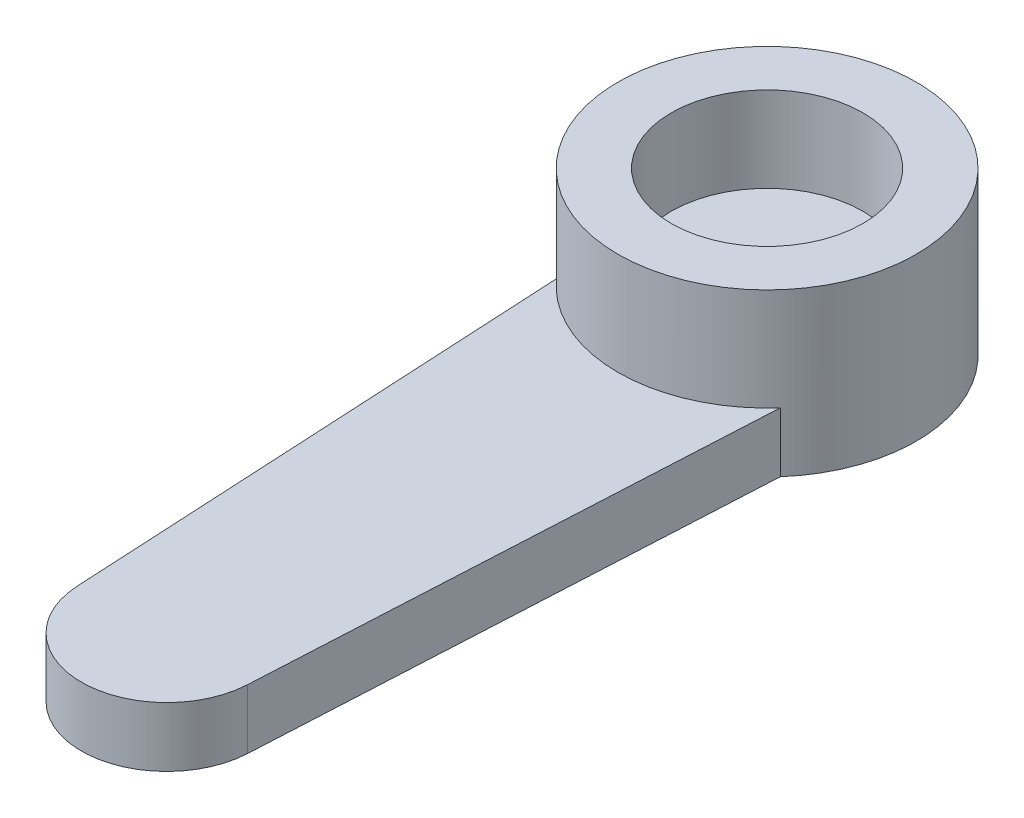
ISO-10303-21;
HEADER;
FILE_DESCRIPTION(('STEP AP214'),'2;1');
FILE_NAME('part.step','',(''),(''),'','','');
FILE_SCHEMA(('AUTOMOTIVE_DESIGN { 1 0 10303 214 1 1 1 1 }'));
ENDSEC;
DATA;
#1=APPLICATION_CONTEXT('core data for automotive mechanical design processes');
#2=APPLICATION_PROTOCOL_DEFINITION('international standard','automotive_design',2000,#1);
#3=PRODUCT_CONTEXT('',#1,'mechanical');
#4=PRODUCT('Part','Part','',(#3));
#5=PRODUCT_RELATED_PRODUCT_CATEGORY('part','',(#4));
#6=PRODUCT_DEFINITION_FORMATION('','',#4);
#7=PRODUCT_DEFINITION_CONTEXT('part definition',#1,'design');
#8=PRODUCT_DEFINITION('design','',#6,#7);
#9=PRODUCT_DEFINITION_SHAPE('','',#8);
#10=(LENGTH_UNIT() NAMED_UNIT(*) SI_UNIT(.MILLI.,.METRE.));
#11=(NAMED_UNIT(*) PLANE_ANGLE_UNIT() SI_UNIT($,.RADIAN.));
#12=(NAMED_UNIT(*) SI_UNIT($,.STERADIAN.) SOLID_ANGLE_UNIT());
#13=UNCERTAINTY_MEASURE_WITH_UNIT(LENGTH_MEASURE(1.E-05),#10,'distance_accuracy_value','');
#14=(GEOMETRIC_REPRESENTATION_CONTEXT(3) GLOBAL_UNCERTAINTY_ASSIGNED_CONTEXT((#13)) GLOBAL_UNIT_ASSIGNED_CONTEXT((#10,
#11,#12)) REPRESENTATION_CONTEXT('',''));
#15=CARTESIAN_POINT('',(0.,0.,0.));
#16=DIRECTION('',(0.,0.,1.));
#17=DIRECTION('',(1.,0.,0.));
#18=AXIS2_PLACEMENT_3D('',#15,#16,#17);
#19=CARTESIAN_POINT('',(0.,3.8,0.));
#20=DIRECTION('',(0.,-1.,0.));
#21=DIRECTION('',(0.,0.,-1.));
#22=AXIS2_PLACEMENT_3D('',#19,#20,#21);
#23=CYLINDRICAL_SURFACE('',#22,3.5);
#24=CARTESIAN_POINT('',(0.,3.8,0.));
#25=DIRECTION('',(0.,1.,0.));
#26=DIRECTION('',(0.,0.,1.));
#27=AXIS2_PLACEMENT_3D('',#24,#25,#26);
#28=CIRCLE('',#27,3.5);
#29=CARTESIAN_POINT('',(0.,3.8,3.5));
#30=VERTEX_POINT('',#29);
#31=EDGE_CURVE('E11',#30,#30,#28,.T.);
#32=ORIENTED_EDGE('',*,*,#31,.F.);
#33=EDGE_LOOP('',(#32));
#34=FACE_BOUND('',#33,.T.);
#35=CARTESIAN_POINT('',(0.,1.4,0.));
#36=DIRECTION('',(0.,1.,0.));
#37=DIRECTION('',(0.,0.,-1.));
#38=AXIS2_PLACEMENT_3D('',#35,#36,#37);
#39=CIRCLE('',#38,3.5);
#40=CARTESIAN_POINT('',(-2.625,1.4,2.31503239718152));
#41=VERTEX_POINT('',#40);
#42=CARTESIAN_POINT('',(2.625,1.4,2.31503239718152));
#43=VERTEX_POINT('',#42);
#44=EDGE_CURVE('E47',#41,#43,#39,.T.);
#45=ORIENTED_EDGE('',*,*,#44,.T.);
#46=DIRECTION('',(0.,-1.,0.));
#47=VECTOR('',#46,1.);
#48=CARTESIAN_POINT('',(2.625,1.4,2.31503239718152));
#49=LINE('',#48,#47);
#50=CARTESIAN_POINT('',(2.625,0.,2.31503239718152));
#51=VERTEX_POINT('',#50);
#52=EDGE_CURVE('E108',#43,#51,#49,.T.);
#53=ORIENTED_EDGE('',*,*,#52,.T.);
#54=CARTESIAN_POINT('',(0.,0.,0.));
#55=DIRECTION('',(0.,1.,0.));
#56=DIRECTION('',(0.,0.,1.));
#57=AXIS2_PLACEMENT_3D('',#54,#55,#56);
#58=CIRCLE('',#57,3.5);
#59=CARTESIAN_POINT('',(-2.625,0.,2.31503239718152));
#60=VERTEX_POINT('',#59);
#61=EDGE_CURVE('E36',#51,#60,#58,.T.);
#62=ORIENTED_EDGE('',*,*,#61,.T.);
#63=DIRECTION('',(0.,-1.,0.));
#64=VECTOR('',#63,1.);
#65=CARTESIAN_POINT('',(-2.625,1.4,2.31503239718152));
#66=LINE('',#65,#64);
#67=EDGE_CURVE('E52',#41,#60,#66,.T.);
#68=ORIENTED_EDGE('',*,*,#67,.F.);
#69=EDGE_LOOP('',(#45,#53,#62,#68));
#70=FACE_BOUND('',#69,.T.);
#71=ADVANCED_FACE('F33',(#34,#70),#23,.T.);
#72=CARTESIAN_POINT('',(0.,3.8,0.));
#73=DIRECTION('',(0.,1.,0.));
#74=DIRECTION('',(0.,0.,1.));
#75=AXIS2_PLACEMENT_3D('',#72,#73,#74);
#76=PLANE('',#75);
#77=CARTESIAN_POINT('',(0.,3.8,0.));
#78=DIRECTION('',(0.,1.,0.));
#79=DIRECTION('',(0.,0.,1.));
#80=AXIS2_PLACEMENT_3D('',#77,#78,#79);
#81=CIRCLE('',#80,2.25);
#82=CARTESIAN_POINT('',(0.,3.8,2.25));
#83=VERTEX_POINT('',#82);
#84=EDGE_CURVE('E98',#83,#83,#81,.T.);
#85=ORIENTED_EDGE('',*,*,#84,.F.);
#86=EDGE_LOOP('',(#85));
#87=FACE_BOUND('',#86,.T.);
#88=ORIENTED_EDGE('',*,*,#31,.T.);
#89=EDGE_LOOP('',(#88));
#90=FACE_BOUND('',#89,.T.);
#91=ADVANCED_FACE('F116',(#87,#90),#76,.T.);
#92=CARTESIAN_POINT('',(0.,0.,0.));
#93=DIRECTION('',(0.,1.,0.));
#94=DIRECTION('',(0.,0.,1.));
#95=AXIS2_PLACEMENT_3D('',#92,#93,#94);
#96=PLANE('',#95);
#97=ORIENTED_EDGE('',*,*,#61,.F.);
#98=DIRECTION('',(-0.052548056490196,0.,0.998618396465388));
#99=VECTOR('',#98,1.);
#100=CARTESIAN_POINT('',(2.625,0.,2.31503239718152));
#101=LINE('',#100,#99);
#102=CARTESIAN_POINT('',(2.,0.,14.1924744850219));
#103=VERTEX_POINT('',#102);
#104=EDGE_CURVE('E93',#51,#103,#101,.T.);
#105=ORIENTED_EDGE('',*,*,#104,.T.);
#106=CARTESIAN_POINT('',(0.,0.,14.0872329699923));
#107=DIRECTION('',(0.,-1.,0.));
#108=DIRECTION('',(0.,0.,1.));
#109=AXIS2_PLACEMENT_3D('',#106,#107,#108);
#110=CIRCLE('',#109,2.00276703000766);
#111=CARTESIAN_POINT('',(-2.,0.,14.1924744850219));
#112=VERTEX_POINT('',#111);
#113=EDGE_CURVE('E103',#103,#112,#110,.T.);
#114=ORIENTED_EDGE('',*,*,#113,.T.);
#115=DIRECTION('',(-0.052548056490196,0.,-0.998618396465388));
#116=VECTOR('',#115,1.);
#117=CARTESIAN_POINT('',(-2.,0.,14.1924744850219));
#118=LINE('',#117,#116);
#119=EDGE_CURVE('E77',#112,#60,#118,.T.);
#120=ORIENTED_EDGE('',*,*,#119,.T.);
#121=EDGE_LOOP('',(#97,#105,#114,#120));
#122=FACE_BOUND('',#121,.T.);
#123=ADVANCED_FACE('F111',(#122),#96,.F.);
#124=CARTESIAN_POINT('',(0.,1.4,14.0872329699923));
#125=DIRECTION('',(0.,-1.,0.));
#126=DIRECTION('',(0.,0.,-1.));
#127=AXIS2_PLACEMENT_3D('',#124,#125,#126);
#128=CYLINDRICAL_SURFACE('',#127,2.00276703000766);
#129=ORIENTED_EDGE('',*,*,#113,.F.);
#130=DIRECTION('',(0.,-1.,0.));
#131=VECTOR('',#130,1.);
#132=CARTESIAN_POINT('',(2.,1.4,14.1924744850219));
#133=LINE('',#132,#131);
#134=CARTESIAN_POINT('',(2.,1.4,14.1924744850219));
#135=VERTEX_POINT('',#134);
#136=EDGE_CURVE('E92',#135,#103,#133,.T.);
#137=ORIENTED_EDGE('',*,*,#136,.F.);
#138=CARTESIAN_POINT('',(0.,1.4,14.0872329699923));
#139=DIRECTION('',(0.,-1.,0.));
#140=DIRECTION('',(0.,0.,1.));
#141=AXIS2_PLACEMENT_3D('',#138,#139,#140);
#142=CIRCLE('',#141,2.00276703000766);
#143=CARTESIAN_POINT('',(-2.,1.4,14.1924744850219));
#144=VERTEX_POINT('',#143);
#145=EDGE_CURVE('E88',#135,#144,#142,.T.);
#146=ORIENTED_EDGE('',*,*,#145,.T.);
#147=DIRECTION('',(0.,-1.,0.));
#148=VECTOR('',#147,1.);
#149=CARTESIAN_POINT('',(-2.,1.4,14.1924744850219));
#150=LINE('',#149,#148);
#151=EDGE_CURVE('E72',#144,#112,#150,.T.);
#152=ORIENTED_EDGE('',*,*,#151,.T.);
#153=EDGE_LOOP('',(#129,#137,#146,#152));
#154=FACE_BOUND('',#153,.T.);
#155=ADVANCED_FACE('F91',(#154),#128,.T.);
#156=CARTESIAN_POINT('',(2.625,1.4,2.31503239718152));
#157=DIRECTION('',(0.998618396465388,0.,0.052548056490196));
#158=DIRECTION('',(0.052548056490196,0.,-0.998618396465388));
#159=AXIS2_PLACEMENT_3D('',#156,#157,#158);
#160=PLANE('',#159);
#161=ORIENTED_EDGE('',*,*,#104,.F.);
#162=ORIENTED_EDGE('',*,*,#52,.F.);
#163=DIRECTION('',(-0.052548056490196,0.,0.998618396465388));
#164=VECTOR('',#163,1.);
#165=CARTESIAN_POINT('',(2.625,1.4,2.31503239718152));
#166=LINE('',#165,#164);
#167=EDGE_CURVE('E82',#43,#135,#166,.T.);
#168=ORIENTED_EDGE('',*,*,#167,.T.);
#169=ORIENTED_EDGE('',*,*,#136,.T.);
#170=EDGE_LOOP('',(#161,#162,#168,#169));
#171=FACE_BOUND('',#170,.T.);
#172=ADVANCED_FACE('F114',(#171),#160,.T.);
#173=CARTESIAN_POINT('',(-2.,1.4,14.1924744850219));
#174=DIRECTION('',(-0.998618396465388,0.,0.052548056490196));
#175=DIRECTION('',(0.052548056490196,0.,0.998618396465388));
#176=AXIS2_PLACEMENT_3D('',#173,#174,#175);
#177=PLANE('',#176);
#178=ORIENTED_EDGE('',*,*,#119,.F.);
#179=ORIENTED_EDGE('',*,*,#151,.F.);
#180=DIRECTION('',(-0.052548056490196,0.,-0.998618396465388));
#181=VECTOR('',#180,1.);
#182=CARTESIAN_POINT('',(-2.,1.4,14.1924744850219));
#183=LINE('',#182,#181);
#184=EDGE_CURVE('E75',#144,#41,#183,.T.);
#185=ORIENTED_EDGE('',*,*,#184,.T.);
#186=ORIENTED_EDGE('',*,*,#67,.T.);
#187=EDGE_LOOP('',(#178,#179,#185,#186));
#188=FACE_BOUND('',#187,.T.);
#189=ADVANCED_FACE('F74',(#188),#177,.T.);
#190=CARTESIAN_POINT('',(0.,1.4,14.0872329699923));
#191=DIRECTION('',(0.,1.,0.));
#192=DIRECTION('',(0.,0.,1.));
#193=AXIS2_PLACEMENT_3D('',#190,#191,#192);
#194=PLANE('',#193);
#195=ORIENTED_EDGE('',*,*,#145,.F.);
#196=ORIENTED_EDGE('',*,*,#167,.F.);
#197=ORIENTED_EDGE('',*,*,#44,.F.);
#198=ORIENTED_EDGE('',*,*,#184,.F.);
#199=EDGE_LOOP('',(#195,#196,#197,#198));
#200=FACE_BOUND('',#199,.T.);
#201=ADVANCED_FACE('F86',(#200),#194,.T.);
#202=CARTESIAN_POINT('',(0.,1.8,0.));
#203=DIRECTION('',(0.,1.,0.));
#204=DIRECTION('',(0.,0.,1.));
#205=AXIS2_PLACEMENT_3D('',#202,#203,#204);
#206=CYLINDRICAL_SURFACE('',#205,2.25);
#207=CARTESIAN_POINT('',(0.,1.8,0.));
#208=DIRECTION('',(0.,1.,0.));
#209=DIRECTION('',(0.,0.,1.));
#210=AXIS2_PLACEMENT_3D('',#207,#208,#209);
#211=CIRCLE('',#210,2.25);
#212=CARTESIAN_POINT('',(0.,1.8,2.25));
#213=VERTEX_POINT('',#212);
#214=EDGE_CURVE('E105',#213,#213,#211,.T.);
#215=ORIENTED_EDGE('',*,*,#214,.F.);
#216=EDGE_LOOP('',(#215));
#217=FACE_BOUND('',#216,.T.);
#218=ORIENTED_EDGE('',*,*,#84,.T.);
#219=EDGE_LOOP('',(#218));
#220=FACE_BOUND('',#219,.T.);
#221=ADVANCED_FACE('F138',(#217,#220),#206,.F.);
#222=CARTESIAN_POINT('',(0.,1.8,0.));
#223=DIRECTION('',(0.,1.,0.));
#224=DIRECTION('',(0.,0.,1.));
#225=AXIS2_PLACEMENT_3D('',#222,#223,#224);
#226=PLANE('',#225);
#227=ORIENTED_EDGE('',*,*,#214,.T.);
#228=EDGE_LOOP('',(#227));
#229=FACE_BOUND('',#228,.T.);
#230=ADVANCED_FACE('F141',(#229),#226,.T.);
#231=CLOSED_SHELL('',(#71,#91,#123,#155,#172,#189,#201,#221,#230));
#232=MANIFOLD_SOLID_BREP('B2',#231);
#233=ADVANCED_BREP_SHAPE_REPRESENTATION('',(#18,#232),#14);
#234=SHAPE_DEFINITION_REPRESENTATION(#9,#233);
ENDSEC;
END-ISO-10303-21;
